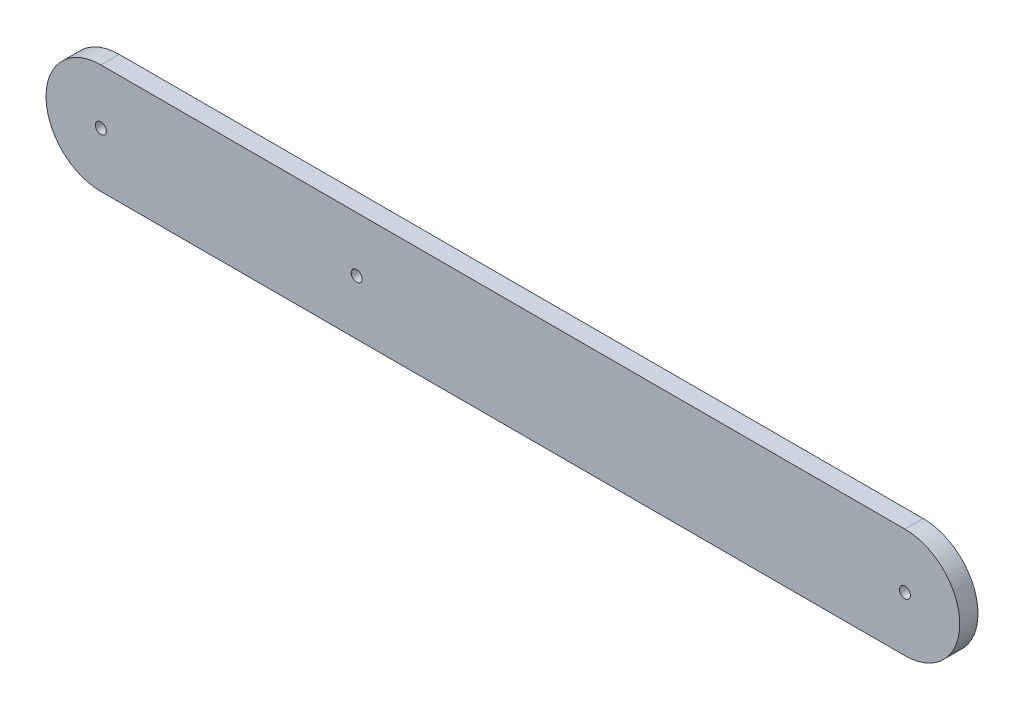
ISO-10303-21;
HEADER;
FILE_DESCRIPTION(('STEP AP214'),'2;1');
FILE_NAME('part.step','',(''),(''),'','','');
FILE_SCHEMA(('AUTOMOTIVE_DESIGN { 1 0 10303 214 1 1 1 1 }'));
ENDSEC;
DATA;
#1=APPLICATION_CONTEXT('core data for automotive mechanical design processes');
#2=APPLICATION_PROTOCOL_DEFINITION('international standard','automotive_design',2000,#1);
#3=PRODUCT_CONTEXT('',#1,'mechanical');
#4=PRODUCT('Part','Part','',(#3));
#5=PRODUCT_RELATED_PRODUCT_CATEGORY('part','',(#4));
#6=PRODUCT_DEFINITION_FORMATION('','',#4);
#7=PRODUCT_DEFINITION_CONTEXT('part definition',#1,'design');
#8=PRODUCT_DEFINITION('design','',#6,#7);
#9=PRODUCT_DEFINITION_SHAPE('','',#8);
#10=(LENGTH_UNIT() NAMED_UNIT(*) SI_UNIT(.MILLI.,.METRE.));
#11=(NAMED_UNIT(*) PLANE_ANGLE_UNIT() SI_UNIT($,.RADIAN.));
#12=(NAMED_UNIT(*) SI_UNIT($,.STERADIAN.) SOLID_ANGLE_UNIT());
#13=UNCERTAINTY_MEASURE_WITH_UNIT(LENGTH_MEASURE(1.E-05),#10,'distance_accuracy_value','');
#14=(GEOMETRIC_REPRESENTATION_CONTEXT(3) GLOBAL_UNCERTAINTY_ASSIGNED_CONTEXT((#13)) GLOBAL_UNIT_ASSIGNED_CONTEXT((#10,
#11,#12)) REPRESENTATION_CONTEXT('',''));
#15=CARTESIAN_POINT('',(0.,0.,0.));
#16=DIRECTION('',(0.,0.,1.));
#17=DIRECTION('',(1.,0.,0.));
#18=AXIS2_PLACEMENT_3D('',#15,#16,#17);
#19=CARTESIAN_POINT('',(-70.,0.,5.));
#20=DIRECTION('',(0.,0.,-1.));
#21=DIRECTION('',(-1.,0.,0.));
#22=AXIS2_PLACEMENT_3D('',#19,#20,#21);
#23=CYLINDRICAL_SURFACE('',#22,15.);
#24=CARTESIAN_POINT('',(-70.,0.,0.));
#25=DIRECTION('',(0.,0.,1.));
#26=DIRECTION('',(1.,0.,0.));
#27=AXIS2_PLACEMENT_3D('',#24,#25,#26);
#28=CIRCLE('',#27,15.);
#29=CARTESIAN_POINT('',(-70.,15.,0.));
#30=VERTEX_POINT('',#29);
#31=CARTESIAN_POINT('',(-70.,-15.,0.));
#32=VERTEX_POINT('',#31);
#33=EDGE_CURVE('E107',#30,#32,#28,.T.);
#34=ORIENTED_EDGE('',*,*,#33,.T.);
#35=DIRECTION('',(0.,0.,-1.));
#36=VECTOR('',#35,1.);
#37=CARTESIAN_POINT('',(-70.,-15.,5.));
#38=LINE('',#37,#36);
#39=CARTESIAN_POINT('',(-70.,-15.,5.));
#40=VERTEX_POINT('',#39);
#41=EDGE_CURVE('E11',#40,#32,#38,.T.);
#42=ORIENTED_EDGE('',*,*,#41,.F.);
#43=CARTESIAN_POINT('',(-70.,0.,5.));
#44=DIRECTION('',(0.,0.,1.));
#45=DIRECTION('',(1.,0.,0.));
#46=AXIS2_PLACEMENT_3D('',#43,#44,#45);
#47=CIRCLE('',#46,15.);
#48=CARTESIAN_POINT('',(-70.,15.,5.));
#49=VERTEX_POINT('',#48);
#50=EDGE_CURVE('E91',#49,#40,#47,.T.);
#51=ORIENTED_EDGE('',*,*,#50,.F.);
#52=DIRECTION('',(0.,0.,-1.));
#53=VECTOR('',#52,1.);
#54=CARTESIAN_POINT('',(-70.,15.,5.));
#55=LINE('',#54,#53);
#56=EDGE_CURVE('E103',#49,#30,#55,.T.);
#57=ORIENTED_EDGE('',*,*,#56,.T.);
#58=EDGE_LOOP('',(#34,#42,#51,#57));
#59=FACE_BOUND('',#58,.T.);
#60=ADVANCED_FACE('F39',(#59),#23,.T.);
#61=CARTESIAN_POINT('',(-70.,-15.,5.));
#62=DIRECTION('',(0.,1.,0.));
#63=DIRECTION('',(-1.,0.,0.));
#64=AXIS2_PLACEMENT_3D('',#61,#62,#63);
#65=PLANE('',#64);
#66=DIRECTION('',(1.,0.,0.));
#67=VECTOR('',#66,1.);
#68=CARTESIAN_POINT('',(-70.,-15.,0.));
#69=LINE('',#68,#67);
#70=CARTESIAN_POINT('',(150.,-15.,0.));
#71=VERTEX_POINT('',#70);
#72=EDGE_CURVE('E96',#32,#71,#69,.T.);
#73=ORIENTED_EDGE('',*,*,#72,.T.);
#74=DIRECTION('',(0.,0.,-1.));
#75=VECTOR('',#74,1.);
#76=CARTESIAN_POINT('',(150.,-15.,5.));
#77=LINE('',#76,#75);
#78=CARTESIAN_POINT('',(150.,-15.,5.));
#79=VERTEX_POINT('',#78);
#80=EDGE_CURVE('E48',#79,#71,#77,.T.);
#81=ORIENTED_EDGE('',*,*,#80,.F.);
#82=DIRECTION('',(1.,0.,0.));
#83=VECTOR('',#82,1.);
#84=CARTESIAN_POINT('',(-70.,-15.,5.));
#85=LINE('',#84,#83);
#86=EDGE_CURVE('E86',#40,#79,#85,.T.);
#87=ORIENTED_EDGE('',*,*,#86,.F.);
#88=ORIENTED_EDGE('',*,*,#41,.T.);
#89=EDGE_LOOP('',(#73,#81,#87,#88));
#90=FACE_BOUND('',#89,.T.);
#91=ADVANCED_FACE('F95',(#90),#65,.F.);
#92=CARTESIAN_POINT('',(150.,0.,5.));
#93=DIRECTION('',(0.,0.,-1.));
#94=DIRECTION('',(-1.,0.,0.));
#95=AXIS2_PLACEMENT_3D('',#92,#93,#94);
#96=CYLINDRICAL_SURFACE('',#95,15.);
#97=CARTESIAN_POINT('',(150.,0.,0.));
#98=DIRECTION('',(0.,0.,1.));
#99=DIRECTION('',(1.,0.,0.));
#100=AXIS2_PLACEMENT_3D('',#97,#98,#99);
#101=CIRCLE('',#100,15.);
#102=CARTESIAN_POINT('',(150.,15.,0.));
#103=VERTEX_POINT('',#102);
#104=EDGE_CURVE('E73',#71,#103,#101,.T.);
#105=ORIENTED_EDGE('',*,*,#104,.T.);
#106=DIRECTION('',(0.,0.,-1.));
#107=VECTOR('',#106,1.);
#108=CARTESIAN_POINT('',(150.,15.,5.));
#109=LINE('',#108,#107);
#110=CARTESIAN_POINT('',(150.,15.,5.));
#111=VERTEX_POINT('',#110);
#112=EDGE_CURVE('E98',#111,#103,#109,.T.);
#113=ORIENTED_EDGE('',*,*,#112,.F.);
#114=CARTESIAN_POINT('',(150.,0.,5.));
#115=DIRECTION('',(0.,0.,1.));
#116=DIRECTION('',(1.,0.,0.));
#117=AXIS2_PLACEMENT_3D('',#114,#115,#116);
#118=CIRCLE('',#117,15.);
#119=EDGE_CURVE('E89',#79,#111,#118,.T.);
#120=ORIENTED_EDGE('',*,*,#119,.F.);
#121=ORIENTED_EDGE('',*,*,#80,.T.);
#122=EDGE_LOOP('',(#105,#113,#120,#121));
#123=FACE_BOUND('',#122,.T.);
#124=ADVANCED_FACE('F99',(#123),#96,.T.);
#125=CARTESIAN_POINT('',(-70.,15.,5.));
#126=DIRECTION('',(0.,-1.,0.));
#127=DIRECTION('',(1.,0.,0.));
#128=AXIS2_PLACEMENT_3D('',#125,#126,#127);
#129=PLANE('',#128);
#130=DIRECTION('',(-1.,0.,0.));
#131=VECTOR('',#130,1.);
#132=CARTESIAN_POINT('',(-70.,15.,0.));
#133=LINE('',#132,#131);
#134=EDGE_CURVE('E79',#103,#30,#133,.T.);
#135=ORIENTED_EDGE('',*,*,#134,.T.);
#136=ORIENTED_EDGE('',*,*,#56,.F.);
#137=DIRECTION('',(-1.,0.,0.));
#138=VECTOR('',#137,1.);
#139=CARTESIAN_POINT('',(-70.,15.,5.));
#140=LINE('',#139,#138);
#141=EDGE_CURVE('E56',#111,#49,#140,.T.);
#142=ORIENTED_EDGE('',*,*,#141,.F.);
#143=ORIENTED_EDGE('',*,*,#112,.T.);
#144=EDGE_LOOP('',(#135,#136,#142,#143));
#145=FACE_BOUND('',#144,.T.);
#146=ADVANCED_FACE('F121',(#145),#129,.F.);
#147=CARTESIAN_POINT('',(-70.,0.,5.));
#148=DIRECTION('',(0.,0.,1.));
#149=DIRECTION('',(1.,0.,0.));
#150=AXIS2_PLACEMENT_3D('',#147,#148,#149);
#151=PLANE('',#150);
#152=CARTESIAN_POINT('',(150.,0.,5.));
#153=DIRECTION('',(0.,0.,-1.));
#154=DIRECTION('',(-1.,0.,0.));
#155=AXIS2_PLACEMENT_3D('',#152,#153,#154);
#156=CIRCLE('',#155,1.5);
#157=CARTESIAN_POINT('',(148.5,0.,5.));
#158=VERTEX_POINT('',#157);
#159=EDGE_CURVE('E111',#158,#158,#156,.T.);
#160=ORIENTED_EDGE('',*,*,#159,.T.);
#161=EDGE_LOOP('',(#160));
#162=FACE_BOUND('',#161,.T.);
#163=CARTESIAN_POINT('',(0.,0.,5.));
#164=DIRECTION('',(0.,0.,-1.));
#165=DIRECTION('',(-1.,0.,0.));
#166=AXIS2_PLACEMENT_3D('',#163,#164,#165);
#167=CIRCLE('',#166,1.5);
#168=CARTESIAN_POINT('',(-1.5,0.,5.));
#169=VERTEX_POINT('',#168);
#170=EDGE_CURVE('E140',#169,#169,#167,.T.);
#171=ORIENTED_EDGE('',*,*,#170,.T.);
#172=EDGE_LOOP('',(#171));
#173=FACE_BOUND('',#172,.T.);
#174=CARTESIAN_POINT('',(-70.,0.,5.));
#175=DIRECTION('',(0.,0.,-1.));
#176=DIRECTION('',(-1.,0.,0.));
#177=AXIS2_PLACEMENT_3D('',#174,#175,#176);
#178=CIRCLE('',#177,1.5);
#179=CARTESIAN_POINT('',(-71.5,0.,5.));
#180=VERTEX_POINT('',#179);
#181=EDGE_CURVE('E132',#180,#180,#178,.T.);
#182=ORIENTED_EDGE('',*,*,#181,.T.);
#183=EDGE_LOOP('',(#182));
#184=FACE_BOUND('',#183,.T.);
#185=ORIENTED_EDGE('',*,*,#50,.T.);
#186=ORIENTED_EDGE('',*,*,#86,.T.);
#187=ORIENTED_EDGE('',*,*,#119,.T.);
#188=ORIENTED_EDGE('',*,*,#141,.T.);
#189=EDGE_LOOP('',(#185,#186,#187,#188));
#190=FACE_BOUND('',#189,.T.);
#191=ADVANCED_FACE('F87',(#162,#173,#184,#190),#151,.T.);
#192=CARTESIAN_POINT('',(-70.,0.,0.));
#193=DIRECTION('',(0.,0.,1.));
#194=DIRECTION('',(1.,0.,0.));
#195=AXIS2_PLACEMENT_3D('',#192,#193,#194);
#196=PLANE('',#195);
#197=CARTESIAN_POINT('',(150.,0.,0.));
#198=DIRECTION('',(0.,0.,-1.));
#199=DIRECTION('',(-1.,0.,0.));
#200=AXIS2_PLACEMENT_3D('',#197,#198,#199);
#201=CIRCLE('',#200,1.5);
#202=CARTESIAN_POINT('',(148.5,0.,0.));
#203=VERTEX_POINT('',#202);
#204=EDGE_CURVE('E144',#203,#203,#201,.T.);
#205=ORIENTED_EDGE('',*,*,#204,.F.);
#206=EDGE_LOOP('',(#205));
#207=FACE_BOUND('',#206,.T.);
#208=CARTESIAN_POINT('',(0.,0.,0.));
#209=DIRECTION('',(0.,0.,-1.));
#210=DIRECTION('',(-1.,0.,0.));
#211=AXIS2_PLACEMENT_3D('',#208,#209,#210);
#212=CIRCLE('',#211,1.5);
#213=CARTESIAN_POINT('',(-1.5,0.,0.));
#214=VERTEX_POINT('',#213);
#215=EDGE_CURVE('E136',#214,#214,#212,.T.);
#216=ORIENTED_EDGE('',*,*,#215,.F.);
#217=EDGE_LOOP('',(#216));
#218=FACE_BOUND('',#217,.T.);
#219=CARTESIAN_POINT('',(-70.,0.,0.));
#220=DIRECTION('',(0.,0.,-1.));
#221=DIRECTION('',(-1.,0.,0.));
#222=AXIS2_PLACEMENT_3D('',#219,#220,#221);
#223=CIRCLE('',#222,1.5);
#224=CARTESIAN_POINT('',(-71.5,0.,0.));
#225=VERTEX_POINT('',#224);
#226=EDGE_CURVE('E128',#225,#225,#223,.T.);
#227=ORIENTED_EDGE('',*,*,#226,.F.);
#228=EDGE_LOOP('',(#227));
#229=FACE_BOUND('',#228,.T.);
#230=ORIENTED_EDGE('',*,*,#33,.F.);
#231=ORIENTED_EDGE('',*,*,#134,.F.);
#232=ORIENTED_EDGE('',*,*,#104,.F.);
#233=ORIENTED_EDGE('',*,*,#72,.F.);
#234=EDGE_LOOP('',(#230,#231,#232,#233));
#235=FACE_BOUND('',#234,.T.);
#236=ADVANCED_FACE('F124',(#207,#218,#229,#235),#196,.F.);
#237=CARTESIAN_POINT('',(-70.,0.,5.));
#238=DIRECTION('',(0.,0.,-1.));
#239=DIRECTION('',(-1.,0.,0.));
#240=AXIS2_PLACEMENT_3D('',#237,#238,#239);
#241=CYLINDRICAL_SURFACE('',#240,1.5);
#242=ORIENTED_EDGE('',*,*,#181,.F.);
#243=EDGE_LOOP('',(#242));
#244=FACE_BOUND('',#243,.T.);
#245=ORIENTED_EDGE('',*,*,#226,.T.);
#246=EDGE_LOOP('',(#245));
#247=FACE_BOUND('',#246,.T.);
#248=ADVANCED_FACE('F163',(#244,#247),#241,.F.);
#249=CARTESIAN_POINT('',(0.,0.,5.));
#250=DIRECTION('',(0.,0.,-1.));
#251=DIRECTION('',(-1.,0.,0.));
#252=AXIS2_PLACEMENT_3D('',#249,#250,#251);
#253=CYLINDRICAL_SURFACE('',#252,1.5);
#254=ORIENTED_EDGE('',*,*,#170,.F.);
#255=EDGE_LOOP('',(#254));
#256=FACE_BOUND('',#255,.T.);
#257=ORIENTED_EDGE('',*,*,#215,.T.);
#258=EDGE_LOOP('',(#257));
#259=FACE_BOUND('',#258,.T.);
#260=ADVANCED_FACE('F157',(#256,#259),#253,.F.);
#261=CARTESIAN_POINT('',(150.,0.,5.));
#262=DIRECTION('',(0.,0.,-1.));
#263=DIRECTION('',(-1.,0.,0.));
#264=AXIS2_PLACEMENT_3D('',#261,#262,#263);
#265=CYLINDRICAL_SURFACE('',#264,1.5);
#266=ORIENTED_EDGE('',*,*,#159,.F.);
#267=EDGE_LOOP('',(#266));
#268=FACE_BOUND('',#267,.T.);
#269=ORIENTED_EDGE('',*,*,#204,.T.);
#270=EDGE_LOOP('',(#269));
#271=FACE_BOUND('',#270,.T.);
#272=ADVANCED_FACE('F154',(#268,#271),#265,.F.);
#273=CLOSED_SHELL('',(#60,#91,#124,#146,#191,#236,#248,#260,#272));
#274=MANIFOLD_SOLID_BREP('B2',#273);
#275=ADVANCED_BREP_SHAPE_REPRESENTATION('',(#18,#274),#14);
#276=SHAPE_DEFINITION_REPRESENTATION(#9,#275);
ENDSEC;
END-ISO-10303-21;
